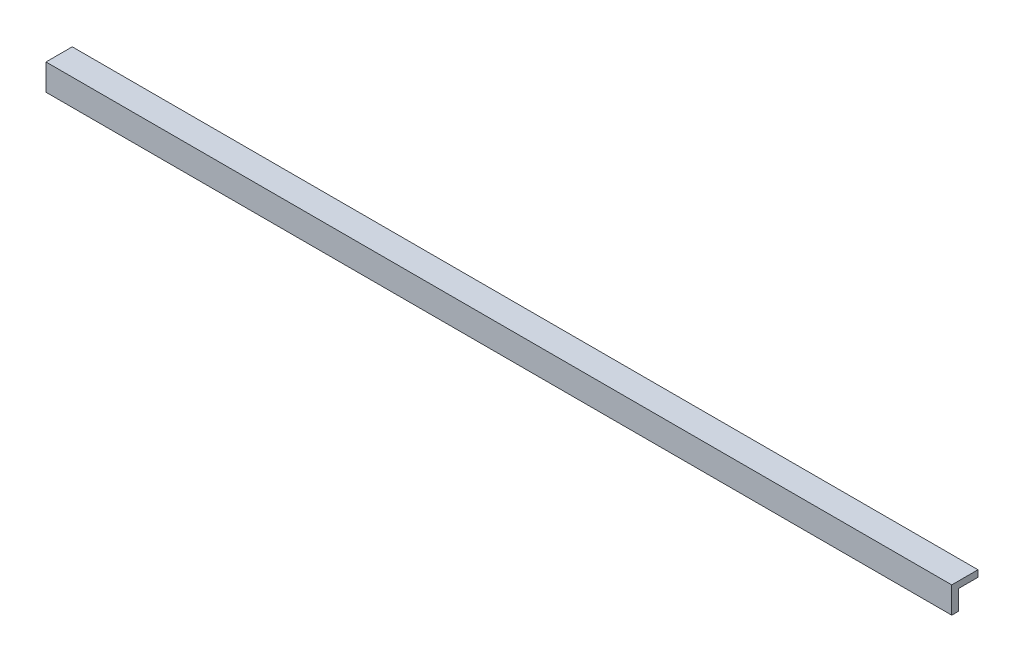
ISO-10303-21;
HEADER;
FILE_DESCRIPTION(('STEP AP214'),'2;1');
FILE_NAME('part.step','',(''),(''),'','','');
FILE_SCHEMA(('AUTOMOTIVE_DESIGN { 1 0 10303 214 1 1 1 1 }'));
ENDSEC;
DATA;
#1=APPLICATION_CONTEXT('core data for automotive mechanical design processes');
#2=APPLICATION_PROTOCOL_DEFINITION('international standard','automotive_design',2000,#1);
#3=PRODUCT_CONTEXT('',#1,'mechanical');
#4=PRODUCT('Part','Part','',(#3));
#5=PRODUCT_RELATED_PRODUCT_CATEGORY('part','',(#4));
#6=PRODUCT_DEFINITION_FORMATION('','',#4);
#7=PRODUCT_DEFINITION_CONTEXT('part definition',#1,'design');
#8=PRODUCT_DEFINITION('design','',#6,#7);
#9=PRODUCT_DEFINITION_SHAPE('','',#8);
#10=(LENGTH_UNIT() NAMED_UNIT(*) SI_UNIT(.MILLI.,.METRE.));
#11=(NAMED_UNIT(*) PLANE_ANGLE_UNIT() SI_UNIT($,.RADIAN.));
#12=(NAMED_UNIT(*) SI_UNIT($,.STERADIAN.) SOLID_ANGLE_UNIT());
#13=UNCERTAINTY_MEASURE_WITH_UNIT(LENGTH_MEASURE(1.E-05),#10,'distance_accuracy_value','');
#14=(GEOMETRIC_REPRESENTATION_CONTEXT(3) GLOBAL_UNCERTAINTY_ASSIGNED_CONTEXT((#13)) GLOBAL_UNIT_ASSIGNED_CONTEXT((#10,
#11,#12)) REPRESENTATION_CONTEXT('',''));
#15=CARTESIAN_POINT('',(0.,0.,0.));
#16=DIRECTION('',(0.,0.,1.));
#17=DIRECTION('',(1.,0.,0.));
#18=AXIS2_PLACEMENT_3D('',#15,#16,#17);
#19=CARTESIAN_POINT('',(219.075,0.,-1.5875));
#20=DIRECTION('',(0.,1.,0.));
#21=DIRECTION('',(0.,0.,1.));
#22=AXIS2_PLACEMENT_3D('',#19,#20,#21);
#23=PLANE('',#22);
#24=DIRECTION('',(0.,0.,-1.));
#25=VECTOR('',#24,1.);
#26=CARTESIAN_POINT('',(0.,0.,-1.5875));
#27=LINE('',#26,#25);
#28=CARTESIAN_POINT('',(0.,0.,0.));
#29=VERTEX_POINT('',#28);
#30=CARTESIAN_POINT('',(0.,0.,-1.5875));
#31=VERTEX_POINT('',#30);
#32=EDGE_CURVE('E123',#29,#31,#27,.T.);
#33=ORIENTED_EDGE('',*,*,#32,.T.);
#34=DIRECTION('',(-1.,0.,0.));
#35=VECTOR('',#34,1.);
#36=CARTESIAN_POINT('',(219.075,0.,-1.5875));
#37=LINE('',#36,#35);
#38=CARTESIAN_POINT('',(219.075,0.,-1.5875));
#39=VERTEX_POINT('',#38);
#40=EDGE_CURVE('E11',#39,#31,#37,.T.);
#41=ORIENTED_EDGE('',*,*,#40,.F.);
#42=DIRECTION('',(0.,0.,-1.));
#43=VECTOR('',#42,1.);
#44=CARTESIAN_POINT('',(219.075,0.,-1.5875));
#45=LINE('',#44,#43);
#46=CARTESIAN_POINT('',(219.075,0.,0.));
#47=VERTEX_POINT('',#46);
#48=EDGE_CURVE('E133',#47,#39,#45,.T.);
#49=ORIENTED_EDGE('',*,*,#48,.F.);
#50=DIRECTION('',(-1.,0.,0.));
#51=VECTOR('',#50,1.);
#52=CARTESIAN_POINT('',(219.075,0.,0.));
#53=LINE('',#52,#51);
#54=EDGE_CURVE('E119',#47,#29,#53,.T.);
#55=ORIENTED_EDGE('',*,*,#54,.T.);
#56=EDGE_LOOP('',(#33,#41,#49,#55));
#57=FACE_BOUND('',#56,.T.);
#58=ADVANCED_FACE('F37',(#57),#23,.F.);
#59=CARTESIAN_POINT('',(219.075,4.7625,-1.5875));
#60=DIRECTION('',(0.,0.,1.));
#61=DIRECTION('',(0.,-1.,0.));
#62=AXIS2_PLACEMENT_3D('',#59,#60,#61);
#63=PLANE('',#62);
#64=DIRECTION('',(0.,1.,0.));
#65=VECTOR('',#64,1.);
#66=CARTESIAN_POINT('',(0.,4.7625,-1.5875));
#67=LINE('',#66,#65);
#68=CARTESIAN_POINT('',(0.,4.7625,-1.5875));
#69=VERTEX_POINT('',#68);
#70=EDGE_CURVE('E126',#31,#69,#67,.T.);
#71=ORIENTED_EDGE('',*,*,#70,.T.);
#72=DIRECTION('',(-1.,0.,0.));
#73=VECTOR('',#72,1.);
#74=CARTESIAN_POINT('',(219.075,4.7625,-1.5875));
#75=LINE('',#74,#73);
#76=CARTESIAN_POINT('',(219.075,4.7625,-1.5875));
#77=VERTEX_POINT('',#76);
#78=EDGE_CURVE('E46',#77,#69,#75,.T.);
#79=ORIENTED_EDGE('',*,*,#78,.F.);
#80=DIRECTION('',(0.,1.,0.));
#81=VECTOR('',#80,1.);
#82=CARTESIAN_POINT('',(219.075,4.7625,-1.5875));
#83=LINE('',#82,#81);
#84=EDGE_CURVE('E91',#39,#77,#83,.T.);
#85=ORIENTED_EDGE('',*,*,#84,.F.);
#86=ORIENTED_EDGE('',*,*,#40,.T.);
#87=EDGE_LOOP('',(#71,#79,#85,#86));
#88=FACE_BOUND('',#87,.T.);
#89=ADVANCED_FACE('F161',(#88),#63,.F.);
#90=CARTESIAN_POINT('',(219.075,4.7625,-6.35));
#91=DIRECTION('',(0.,1.,0.));
#92=DIRECTION('',(0.,0.,1.));
#93=AXIS2_PLACEMENT_3D('',#90,#91,#92);
#94=PLANE('',#93);
#95=DIRECTION('',(0.,0.,-1.));
#96=VECTOR('',#95,1.);
#97=CARTESIAN_POINT('',(0.,4.7625,-6.35));
#98=LINE('',#97,#96);
#99=CARTESIAN_POINT('',(0.,4.7625,-6.35));
#100=VERTEX_POINT('',#99);
#101=EDGE_CURVE('E128',#69,#100,#98,.T.);
#102=ORIENTED_EDGE('',*,*,#101,.T.);
#103=DIRECTION('',(-1.,0.,0.));
#104=VECTOR('',#103,1.);
#105=CARTESIAN_POINT('',(219.075,4.7625,-6.35));
#106=LINE('',#105,#104);
#107=CARTESIAN_POINT('',(219.075,4.7625,-6.35));
#108=VERTEX_POINT('',#107);
#109=EDGE_CURVE('E114',#108,#100,#106,.T.);
#110=ORIENTED_EDGE('',*,*,#109,.F.);
#111=DIRECTION('',(0.,0.,-1.));
#112=VECTOR('',#111,1.);
#113=CARTESIAN_POINT('',(219.075,4.7625,-6.35));
#114=LINE('',#113,#112);
#115=EDGE_CURVE('E104',#77,#108,#114,.T.);
#116=ORIENTED_EDGE('',*,*,#115,.F.);
#117=ORIENTED_EDGE('',*,*,#78,.T.);
#118=EDGE_LOOP('',(#102,#110,#116,#117));
#119=FACE_BOUND('',#118,.T.);
#120=ADVANCED_FACE('F143',(#119),#94,.F.);
#121=CARTESIAN_POINT('',(219.075,6.35,-6.35));
#122=DIRECTION('',(0.,0.,1.));
#123=DIRECTION('',(1.,0.,0.));
#124=AXIS2_PLACEMENT_3D('',#121,#122,#123);
#125=PLANE('',#124);
#126=DIRECTION('',(0.,1.,0.));
#127=VECTOR('',#126,1.);
#128=CARTESIAN_POINT('',(0.,6.35,-6.35));
#129=LINE('',#128,#127);
#130=CARTESIAN_POINT('',(0.,6.35,-6.35));
#131=VERTEX_POINT('',#130);
#132=EDGE_CURVE('E112',#100,#131,#129,.T.);
#133=ORIENTED_EDGE('',*,*,#132,.T.);
#134=DIRECTION('',(-1.,0.,0.));
#135=VECTOR('',#134,1.);
#136=CARTESIAN_POINT('',(219.075,6.35,-6.35));
#137=LINE('',#136,#135);
#138=CARTESIAN_POINT('',(219.075,6.35,-6.35));
#139=VERTEX_POINT('',#138);
#140=EDGE_CURVE('E109',#139,#131,#137,.T.);
#141=ORIENTED_EDGE('',*,*,#140,.F.);
#142=DIRECTION('',(0.,1.,0.));
#143=VECTOR('',#142,1.);
#144=CARTESIAN_POINT('',(219.075,6.35,-6.35));
#145=LINE('',#144,#143);
#146=EDGE_CURVE('E98',#108,#139,#145,.T.);
#147=ORIENTED_EDGE('',*,*,#146,.F.);
#148=ORIENTED_EDGE('',*,*,#109,.T.);
#149=EDGE_LOOP('',(#133,#141,#147,#148));
#150=FACE_BOUND('',#149,.T.);
#151=ADVANCED_FACE('F110',(#150),#125,.F.);
#152=CARTESIAN_POINT('',(219.075,6.35,0.));
#153=DIRECTION('',(0.,-1.,0.));
#154=DIRECTION('',(0.,0.,-1.));
#155=AXIS2_PLACEMENT_3D('',#152,#153,#154);
#156=PLANE('',#155);
#157=DIRECTION('',(0.,0.,1.));
#158=VECTOR('',#157,1.);
#159=CARTESIAN_POINT('',(0.,6.35,0.));
#160=LINE('',#159,#158);
#161=CARTESIAN_POINT('',(0.,6.35,0.));
#162=VERTEX_POINT('',#161);
#163=EDGE_CURVE('E77',#131,#162,#160,.T.);
#164=ORIENTED_EDGE('',*,*,#163,.T.);
#165=DIRECTION('',(-1.,0.,0.));
#166=VECTOR('',#165,1.);
#167=CARTESIAN_POINT('',(219.075,6.35,0.));
#168=LINE('',#167,#166);
#169=CARTESIAN_POINT('',(219.075,6.35,0.));
#170=VERTEX_POINT('',#169);
#171=EDGE_CURVE('E115',#170,#162,#168,.T.);
#172=ORIENTED_EDGE('',*,*,#171,.F.);
#173=DIRECTION('',(0.,0.,1.));
#174=VECTOR('',#173,1.);
#175=CARTESIAN_POINT('',(219.075,6.35,0.));
#176=LINE('',#175,#174);
#177=EDGE_CURVE('E102',#139,#170,#176,.T.);
#178=ORIENTED_EDGE('',*,*,#177,.F.);
#179=ORIENTED_EDGE('',*,*,#140,.T.);
#180=EDGE_LOOP('',(#164,#172,#178,#179));
#181=FACE_BOUND('',#180,.T.);
#182=ADVANCED_FACE('F117',(#181),#156,.F.);
#183=CARTESIAN_POINT('',(219.075,0.,0.));
#184=DIRECTION('',(0.,0.,-1.));
#185=DIRECTION('',(-1.,0.,0.));
#186=AXIS2_PLACEMENT_3D('',#183,#184,#185);
#187=PLANE('',#186);
#188=DIRECTION('',(0.,-1.,0.));
#189=VECTOR('',#188,1.);
#190=CARTESIAN_POINT('',(0.,0.,0.));
#191=LINE('',#190,#189);
#192=EDGE_CURVE('E83',#162,#29,#191,.T.);
#193=ORIENTED_EDGE('',*,*,#192,.T.);
#194=ORIENTED_EDGE('',*,*,#54,.F.);
#195=DIRECTION('',(0.,-1.,0.));
#196=VECTOR('',#195,1.);
#197=CARTESIAN_POINT('',(219.075,0.,0.));
#198=LINE('',#197,#196);
#199=EDGE_CURVE('E54',#170,#47,#198,.T.);
#200=ORIENTED_EDGE('',*,*,#199,.F.);
#201=ORIENTED_EDGE('',*,*,#171,.T.);
#202=EDGE_LOOP('',(#193,#194,#200,#201));
#203=FACE_BOUND('',#202,.T.);
#204=ADVANCED_FACE('F150',(#203),#187,.F.);
#205=CARTESIAN_POINT('',(219.075,0.,0.));
#206=DIRECTION('',(-1.,0.,0.));
#207=DIRECTION('',(0.,0.,1.));
#208=AXIS2_PLACEMENT_3D('',#205,#206,#207);
#209=PLANE('',#208);
#210=ORIENTED_EDGE('',*,*,#48,.T.);
#211=ORIENTED_EDGE('',*,*,#84,.T.);
#212=ORIENTED_EDGE('',*,*,#115,.T.);
#213=ORIENTED_EDGE('',*,*,#146,.T.);
#214=ORIENTED_EDGE('',*,*,#177,.T.);
#215=ORIENTED_EDGE('',*,*,#199,.T.);
#216=EDGE_LOOP('',(#210,#211,#212,#213,#214,#215));
#217=FACE_BOUND('',#216,.T.);
#218=ADVANCED_FACE('F100',(#217),#209,.F.);
#219=CARTESIAN_POINT('',(0.,0.,0.));
#220=DIRECTION('',(-1.,0.,0.));
#221=DIRECTION('',(0.,0.,1.));
#222=AXIS2_PLACEMENT_3D('',#219,#220,#221);
#223=PLANE('',#222);
#224=ORIENTED_EDGE('',*,*,#32,.F.);
#225=ORIENTED_EDGE('',*,*,#192,.F.);
#226=ORIENTED_EDGE('',*,*,#163,.F.);
#227=ORIENTED_EDGE('',*,*,#132,.F.);
#228=ORIENTED_EDGE('',*,*,#101,.F.);
#229=ORIENTED_EDGE('',*,*,#70,.F.);
#230=EDGE_LOOP('',(#224,#225,#226,#227,#228,#229));
#231=FACE_BOUND('',#230,.T.);
#232=ADVANCED_FACE('F146',(#231),#223,.T.);
#233=CLOSED_SHELL('',(#58,#89,#120,#151,#182,#204,#218,#232));
#234=MANIFOLD_SOLID_BREP('B2',#233);
#235=ADVANCED_BREP_SHAPE_REPRESENTATION('',(#18,#234),#14);
#236=SHAPE_DEFINITION_REPRESENTATION(#9,#235);
ENDSEC;
END-ISO-10303-21;
